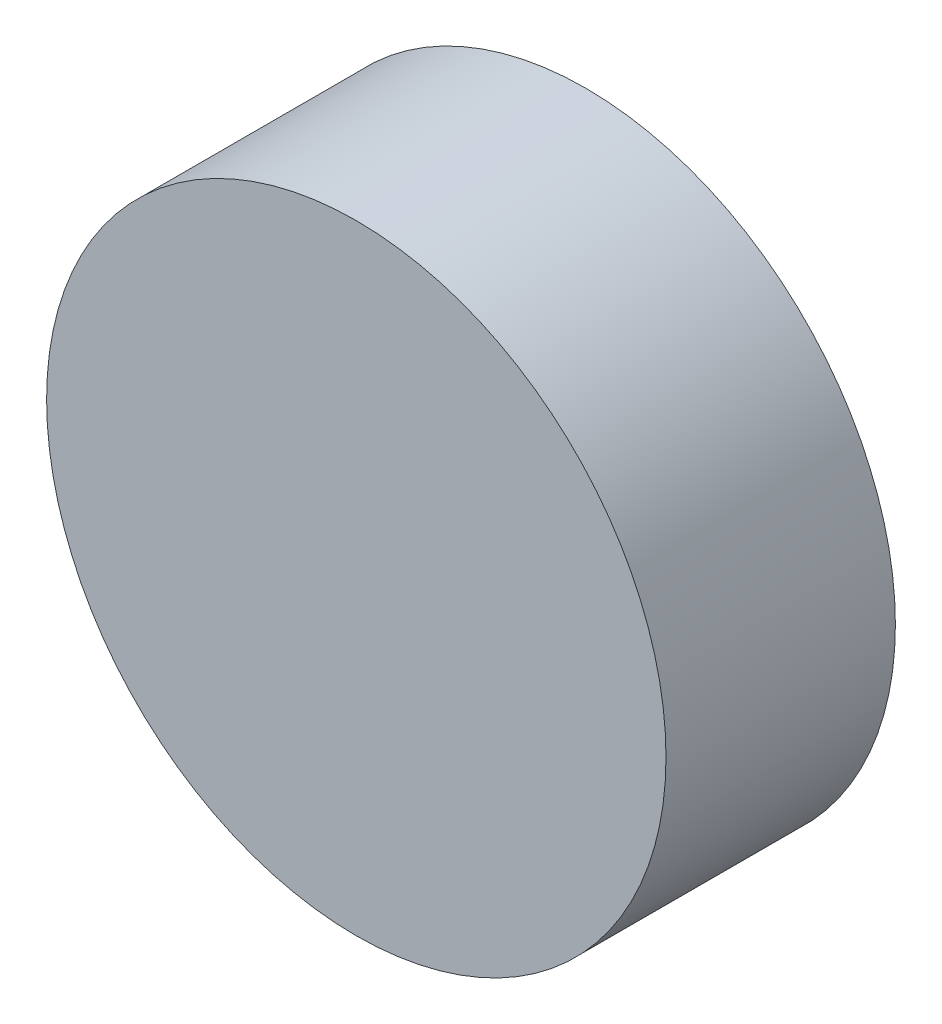
ISO-10303-21;
HEADER;
FILE_DESCRIPTION(('STEP AP214'),'2;1');
FILE_NAME('part.step','',(''),(''),'','','');
FILE_SCHEMA(('AUTOMOTIVE_DESIGN { 1 0 10303 214 1 1 1 1 }'));
ENDSEC;
DATA;
#1=APPLICATION_CONTEXT('core data for automotive mechanical design processes');
#2=APPLICATION_PROTOCOL_DEFINITION('international standard','automotive_design',2000,#1);
#3=PRODUCT_CONTEXT('',#1,'mechanical');
#4=PRODUCT('Part','Part','',(#3));
#5=PRODUCT_RELATED_PRODUCT_CATEGORY('part','',(#4));
#6=PRODUCT_DEFINITION_FORMATION('','',#4);
#7=PRODUCT_DEFINITION_CONTEXT('part definition',#1,'design');
#8=PRODUCT_DEFINITION('design','',#6,#7);
#9=PRODUCT_DEFINITION_SHAPE('','',#8);
#10=(LENGTH_UNIT() NAMED_UNIT(*) SI_UNIT(.MILLI.,.METRE.));
#11=(NAMED_UNIT(*) PLANE_ANGLE_UNIT() SI_UNIT($,.RADIAN.));
#12=(NAMED_UNIT(*) SI_UNIT($,.STERADIAN.) SOLID_ANGLE_UNIT());
#13=UNCERTAINTY_MEASURE_WITH_UNIT(LENGTH_MEASURE(1.E-05),#10,'distance_accuracy_value','');
#14=(GEOMETRIC_REPRESENTATION_CONTEXT(3) GLOBAL_UNCERTAINTY_ASSIGNED_CONTEXT((#13)) GLOBAL_UNIT_ASSIGNED_CONTEXT((#10,
#11,#12)) REPRESENTATION_CONTEXT('',''));
#15=CARTESIAN_POINT('',(0.,0.,0.));
#16=DIRECTION('',(0.,0.,1.));
#17=DIRECTION('',(1.,0.,0.));
#18=AXIS2_PLACEMENT_3D('',#15,#16,#17);
#19=CARTESIAN_POINT('',(0.,0.,10.));
#20=DIRECTION('',(0.,0.,-1.));
#21=DIRECTION('',(-1.,0.,0.));
#22=AXIS2_PLACEMENT_3D('',#19,#20,#21);
#23=CYLINDRICAL_SURFACE('',#22,13.5);
#24=CARTESIAN_POINT('',(0.,0.,10.));
#25=DIRECTION('',(0.,0.,1.));
#26=DIRECTION('',(1.,0.,0.));
#27=AXIS2_PLACEMENT_3D('',#24,#25,#26);
#28=CIRCLE('',#27,13.5);
#29=CARTESIAN_POINT('',(13.5,0.,10.));
#30=VERTEX_POINT('',#29);
#31=EDGE_CURVE('E10',#30,#30,#28,.T.);
#32=ORIENTED_EDGE('',*,*,#31,.F.);
#33=EDGE_LOOP('',(#32));
#34=FACE_BOUND('',#33,.T.);
#35=CARTESIAN_POINT('',(0.,0.,0.));
#36=DIRECTION('',(0.,0.,1.));
#37=DIRECTION('',(1.,0.,0.));
#38=AXIS2_PLACEMENT_3D('',#35,#36,#37);
#39=CIRCLE('',#38,13.5);
#40=CARTESIAN_POINT('',(13.5,0.,0.));
#41=VERTEX_POINT('',#40);
#42=EDGE_CURVE('E35',#41,#41,#39,.T.);
#43=ORIENTED_EDGE('',*,*,#42,.T.);
#44=EDGE_LOOP('',(#43));
#45=FACE_BOUND('',#44,.T.);
#46=ADVANCED_FACE('F29',(#34,#45),#23,.T.);
#47=CARTESIAN_POINT('',(0.,0.,10.));
#48=DIRECTION('',(0.,0.,1.));
#49=DIRECTION('',(1.,0.,0.));
#50=AXIS2_PLACEMENT_3D('',#47,#48,#49);
#51=PLANE('',#50);
#52=ORIENTED_EDGE('',*,*,#31,.T.);
#53=EDGE_LOOP('',(#52));
#54=FACE_BOUND('',#53,.T.);
#55=ADVANCED_FACE('F44',(#54),#51,.T.);
#56=CARTESIAN_POINT('',(0.,0.,0.));
#57=DIRECTION('',(0.,0.,1.));
#58=DIRECTION('',(1.,0.,0.));
#59=AXIS2_PLACEMENT_3D('',#56,#57,#58);
#60=PLANE('',#59);
#61=ORIENTED_EDGE('',*,*,#42,.F.);
#62=EDGE_LOOP('',(#61));
#63=FACE_BOUND('',#62,.T.);
#64=ADVANCED_FACE('F42',(#63),#60,.F.);
#65=CLOSED_SHELL('',(#46,#55,#64));
#66=MANIFOLD_SOLID_BREP('B2',#65);
#67=ADVANCED_BREP_SHAPE_REPRESENTATION('',(#18,#66),#14);
#68=SHAPE_DEFINITION_REPRESENTATION(#9,#67);
ENDSEC;
END-ISO-10303-21;
